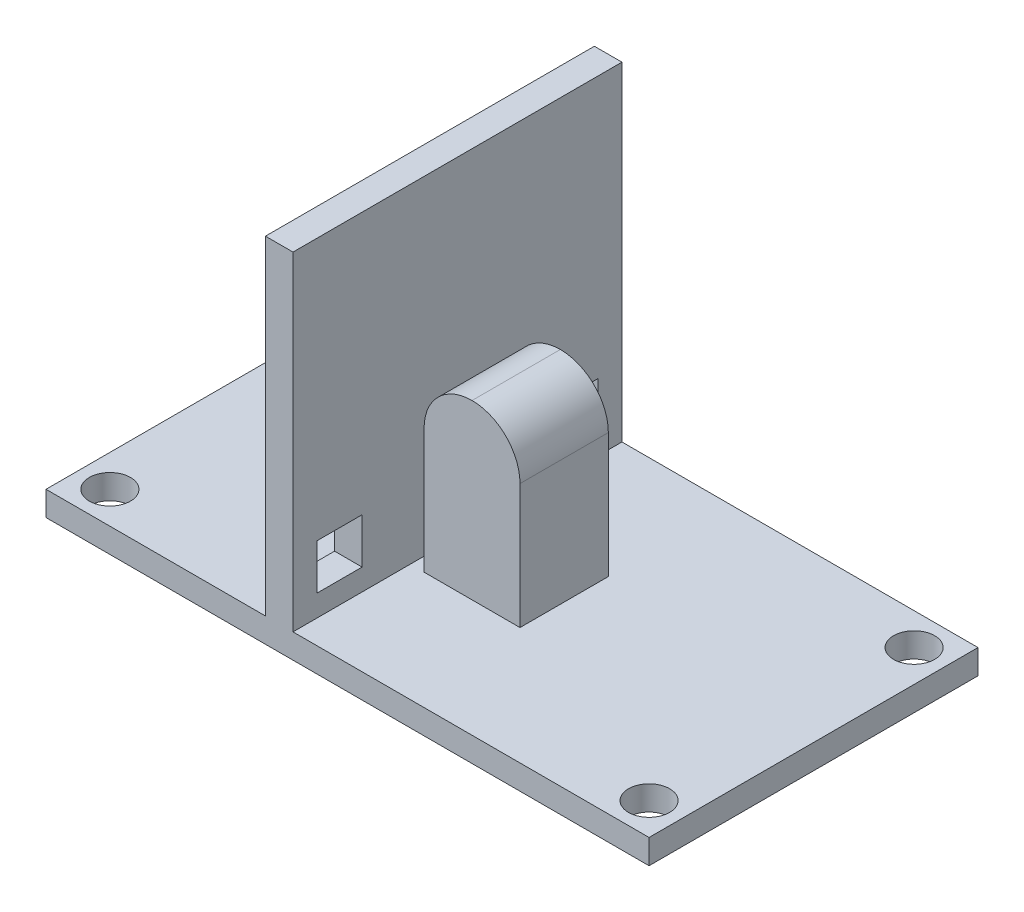
ISO-10303-21;
HEADER;
FILE_DESCRIPTION(('STEP AP214'),'2;1');
FILE_NAME('part.step','',(''),(''),'','','');
FILE_SCHEMA(('AUTOMOTIVE_DESIGN { 1 0 10303 214 1 1 1 1 }'));
ENDSEC;
DATA;
#1=APPLICATION_CONTEXT('core data for automotive mechanical design processes');
#2=APPLICATION_PROTOCOL_DEFINITION('international standard','automotive_design',2000,#1);
#3=PRODUCT_CONTEXT('',#1,'mechanical');
#4=PRODUCT('Part','Part','',(#3));
#5=PRODUCT_RELATED_PRODUCT_CATEGORY('part','',(#4));
#6=PRODUCT_DEFINITION_FORMATION('','',#4);
#7=PRODUCT_DEFINITION_CONTEXT('part definition',#1,'design');
#8=PRODUCT_DEFINITION('design','',#6,#7);
#9=PRODUCT_DEFINITION_SHAPE('','',#8);
#10=(LENGTH_UNIT() NAMED_UNIT(*) SI_UNIT(.MILLI.,.METRE.));
#11=(NAMED_UNIT(*) PLANE_ANGLE_UNIT() SI_UNIT($,.RADIAN.));
#12=(NAMED_UNIT(*) SI_UNIT($,.STERADIAN.) SOLID_ANGLE_UNIT());
#13=UNCERTAINTY_MEASURE_WITH_UNIT(LENGTH_MEASURE(1.E-05),#10,'distance_accuracy_value','');
#14=(GEOMETRIC_REPRESENTATION_CONTEXT(3) GLOBAL_UNCERTAINTY_ASSIGNED_CONTEXT((#13)) GLOBAL_UNIT_ASSIGNED_CONTEXT((#10,
#11,#12)) REPRESENTATION_CONTEXT('',''));
#15=CARTESIAN_POINT('',(0.,0.,0.));
#16=DIRECTION('',(0.,0.,1.));
#17=DIRECTION('',(1.,0.,0.));
#18=AXIS2_PLACEMENT_3D('',#15,#16,#17);
#19=CARTESIAN_POINT('',(0.,2.84,0.));
#20=DIRECTION('',(0.,1.,0.));
#21=DIRECTION('',(0.,0.,1.));
#22=AXIS2_PLACEMENT_3D('',#19,#20,#21);
#23=PLANE('',#22);
#24=CARTESIAN_POINT('',(-54.0349872808047,2.84,-4.2136213119799));
#25=DIRECTION('',(0.,1.,0.));
#26=DIRECTION('',(0.,0.,1.));
#27=AXIS2_PLACEMENT_3D('',#24,#25,#26);
#28=CIRCLE('',#27,2.38125);
#29=CARTESIAN_POINT('',(-54.0349872808047,2.84,-1.8323713119799));
#30=VERTEX_POINT('',#29);
#31=EDGE_CURVE('E340',#30,#30,#28,.T.);
#32=ORIENTED_EDGE('',*,*,#31,.F.);
#33=EDGE_LOOP('',(#32));
#34=FACE_BOUND('',#33,.T.);
#35=CARTESIAN_POINT('',(-54.0349872808047,2.84,26.4863786880201));
#36=DIRECTION('',(0.,1.,0.));
#37=DIRECTION('',(0.,0.,1.));
#38=AXIS2_PLACEMENT_3D('',#35,#36,#37);
#39=CIRCLE('',#38,2.38125);
#40=CARTESIAN_POINT('',(-54.0349872808047,2.84,28.8676286880201));
#41=VERTEX_POINT('',#40);
#42=EDGE_CURVE('E332',#41,#41,#39,.T.);
#43=ORIENTED_EDGE('',*,*,#42,.F.);
#44=EDGE_LOOP('',(#43));
#45=FACE_BOUND('',#44,.T.);
#46=DIRECTION('',(0.,0.,1.));
#47=VECTOR('',#46,1.);
#48=CARTESIAN_POINT('',(-32.3171715619431,2.84,-7.9136213119799));
#49=LINE('',#48,#47);
#50=CARTESIAN_POINT('',(-32.3171715619431,2.84,17.6363786880201));
#51=VERTEX_POINT('',#50);
#52=CARTESIAN_POINT('',(-32.3171715619431,2.84,30.1863786880201));
#53=VERTEX_POINT('',#52);
#54=EDGE_CURVE('E231',#51,#53,#49,.T.);
#55=ORIENTED_EDGE('',*,*,#54,.F.);
#56=DIRECTION('',(1.,0.,0.));
#57=VECTOR('',#56,1.);
#58=CARTESIAN_POINT('',(-36.8171715619431,2.84,17.6363786880201));
#59=LINE('',#58,#57);
#60=CARTESIAN_POINT('',(-44.8171715619431,2.84,17.6363786880201));
#61=VERTEX_POINT('',#60);
#62=EDGE_CURVE('E409',#61,#51,#59,.T.);
#63=ORIENTED_EDGE('',*,*,#62,.F.);
#64=DIRECTION('',(0.,0.,1.));
#65=VECTOR('',#64,1.);
#66=CARTESIAN_POINT('',(-44.8171715619431,2.84,3.1363786880201));
#67=LINE('',#66,#65);
#68=CARTESIAN_POINT('',(-44.8171715619431,2.84,3.1363786880201));
#69=VERTEX_POINT('',#68);
#70=EDGE_CURVE('E212',#69,#61,#67,.T.);
#71=ORIENTED_EDGE('',*,*,#70,.F.);
#72=DIRECTION('',(-1.,0.,0.));
#73=VECTOR('',#72,1.);
#74=CARTESIAN_POINT('',(-36.8171715619431,2.84,3.1363786880201));
#75=LINE('',#74,#73);
#76=CARTESIAN_POINT('',(-32.3171715619431,2.84,3.1363786880201));
#77=VERTEX_POINT('',#76);
#78=EDGE_CURVE('E204',#77,#69,#75,.T.);
#79=ORIENTED_EDGE('',*,*,#78,.F.);
#80=CARTESIAN_POINT('',(-32.3171715619431,2.84,-7.9136213119799));
#81=VERTEX_POINT('',#80);
#82=EDGE_CURVE('E208',#81,#77,#49,.T.);
#83=ORIENTED_EDGE('',*,*,#82,.F.);
#84=DIRECTION('',(-1.,0.,0.));
#85=VECTOR('',#84,1.);
#86=CARTESIAN_POINT('',(-57.7349872808047,2.84,-7.9136213119799));
#87=LINE('',#86,#85);
#88=CARTESIAN_POINT('',(-57.7349872808047,2.84,-7.9136213119799));
#89=VERTEX_POINT('',#88);
#90=EDGE_CURVE('E281',#81,#89,#87,.T.);
#91=ORIENTED_EDGE('',*,*,#90,.T.);
#92=DIRECTION('',(0.,0.,1.));
#93=VECTOR('',#92,1.);
#94=CARTESIAN_POINT('',(-57.7349872808047,2.84,-7.9136213119799));
#95=LINE('',#94,#93);
#96=CARTESIAN_POINT('',(-57.7349872808047,2.84,30.1863786880201));
#97=VERTEX_POINT('',#96);
#98=EDGE_CURVE('E271',#89,#97,#95,.T.);
#99=ORIENTED_EDGE('',*,*,#98,.T.);
#100=DIRECTION('',(1.,0.,0.));
#101=VECTOR('',#100,1.);
#102=CARTESIAN_POINT('',(-57.7349872808047,2.84,30.1863786880201));
#103=LINE('',#102,#101);
#104=EDGE_CURVE('E276',#97,#53,#103,.T.);
#105=ORIENTED_EDGE('',*,*,#104,.T.);
#106=EDGE_LOOP('',(#55,#63,#71,#79,#83,#91,#99,#105));
#107=FACE_BOUND('',#106,.T.);
#108=ADVANCED_FACE('F34',(#34,#45,#107),#23,.T.);
#109=CARTESIAN_POINT('',(-57.7349872808047,2.84,-7.9136213119799));
#110=DIRECTION('',(1.,0.,0.));
#111=DIRECTION('',(0.,0.,-1.));
#112=AXIS2_PLACEMENT_3D('',#109,#110,#111);
#113=PLANE('',#112);
#114=DIRECTION('',(0.,0.,1.));
#115=VECTOR('',#114,1.);
#116=CARTESIAN_POINT('',(-57.7349872808047,0.,-7.9136213119799));
#117=LINE('',#116,#115);
#118=CARTESIAN_POINT('',(-57.7349872808047,0.,-7.9136213119799));
#119=VERTEX_POINT('',#118);
#120=CARTESIAN_POINT('',(-57.7349872808047,0.,30.1863786880201));
#121=VERTEX_POINT('',#120);
#122=EDGE_CURVE('E270',#119,#121,#117,.T.);
#123=ORIENTED_EDGE('',*,*,#122,.T.);
#124=DIRECTION('',(0.,-1.,0.));
#125=VECTOR('',#124,1.);
#126=CARTESIAN_POINT('',(-57.7349872808047,2.84,30.1863786880201));
#127=LINE('',#126,#125);
#128=EDGE_CURVE('E300',#97,#121,#127,.T.);
#129=ORIENTED_EDGE('',*,*,#128,.F.);
#130=ORIENTED_EDGE('',*,*,#98,.F.);
#131=DIRECTION('',(0.,-1.,0.));
#132=VECTOR('',#131,1.);
#133=CARTESIAN_POINT('',(-57.7349872808047,2.84,-7.9136213119799));
#134=LINE('',#133,#132);
#135=EDGE_CURVE('E284',#89,#119,#134,.T.);
#136=ORIENTED_EDGE('',*,*,#135,.T.);
#137=EDGE_LOOP('',(#123,#129,#130,#136));
#138=FACE_BOUND('',#137,.T.);
#139=ADVANCED_FACE('F435',(#138),#113,.F.);
#140=CARTESIAN_POINT('',(-57.7349872808047,2.84,30.1863786880201));
#141=DIRECTION('',(0.,0.,-1.));
#142=DIRECTION('',(-1.,0.,0.));
#143=AXIS2_PLACEMENT_3D('',#140,#141,#142);
#144=PLANE('',#143);
#145=DIRECTION('',(1.,0.,0.));
#146=VECTOR('',#145,1.);
#147=CARTESIAN_POINT('',(-57.7349872808047,0.,30.1863786880201));
#148=LINE('',#147,#146);
#149=CARTESIAN_POINT('',(12.1150127191953,0.,30.1863786880201));
#150=VERTEX_POINT('',#149);
#151=EDGE_CURVE('E287',#121,#150,#148,.T.);
#152=ORIENTED_EDGE('',*,*,#151,.T.);
#153=DIRECTION('',(0.,-1.,0.));
#154=VECTOR('',#153,1.);
#155=CARTESIAN_POINT('',(12.1150127191953,2.84,30.1863786880201));
#156=LINE('',#155,#154);
#157=CARTESIAN_POINT('',(12.1150127191953,2.84,30.1863786880201));
#158=VERTEX_POINT('',#157);
#159=EDGE_CURVE('E297',#158,#150,#156,.T.);
#160=ORIENTED_EDGE('',*,*,#159,.F.);
#161=CARTESIAN_POINT('',(-29.1249872808047,2.84,30.1863786880201));
#162=VERTEX_POINT('',#161);
#163=EDGE_CURVE('E274',#162,#158,#103,.T.);
#164=ORIENTED_EDGE('',*,*,#163,.F.);
#165=DIRECTION('',(0.,-1.,0.));
#166=VECTOR('',#165,1.);
#167=CARTESIAN_POINT('',(-29.1249872808047,40.94,30.1863786880201));
#168=LINE('',#167,#166);
#169=CARTESIAN_POINT('',(-29.1249872808047,40.94,30.1863786880201));
#170=VERTEX_POINT('',#169);
#171=EDGE_CURVE('E243',#170,#162,#168,.T.);
#172=ORIENTED_EDGE('',*,*,#171,.F.);
#173=DIRECTION('',(-1.,0.,0.));
#174=VECTOR('',#173,1.);
#175=CARTESIAN_POINT('',(-29.1249872808047,40.94,30.1863786880201));
#176=LINE('',#175,#174);
#177=CARTESIAN_POINT('',(-32.3171715619431,40.94,30.1863786880201));
#178=VERTEX_POINT('',#177);
#179=EDGE_CURVE('E417',#170,#178,#176,.T.);
#180=ORIENTED_EDGE('',*,*,#179,.T.);
#181=DIRECTION('',(0.,-1.,0.));
#182=VECTOR('',#181,1.);
#183=CARTESIAN_POINT('',(-32.3171715619431,40.94,30.1863786880201));
#184=LINE('',#183,#182);
#185=EDGE_CURVE('E246',#178,#53,#184,.T.);
#186=ORIENTED_EDGE('',*,*,#185,.T.);
#187=ORIENTED_EDGE('',*,*,#104,.F.);
#188=ORIENTED_EDGE('',*,*,#128,.T.);
#189=EDGE_LOOP('',(#152,#160,#164,#172,#180,#186,#187,#188));
#190=FACE_BOUND('',#189,.T.);
#191=ADVANCED_FACE('F430',(#190),#144,.F.);
#192=CARTESIAN_POINT('',(12.1150127191953,2.84,-7.9136213119799));
#193=DIRECTION('',(-1.,0.,0.));
#194=DIRECTION('',(0.,0.,1.));
#195=AXIS2_PLACEMENT_3D('',#192,#193,#194);
#196=PLANE('',#195);
#197=DIRECTION('',(0.,0.,-1.));
#198=VECTOR('',#197,1.);
#199=CARTESIAN_POINT('',(12.1150127191953,0.,-7.9136213119799));
#200=LINE('',#199,#198);
#201=CARTESIAN_POINT('',(12.1150127191953,0.,-7.9136213119799));
#202=VERTEX_POINT('',#201);
#203=EDGE_CURVE('E289',#150,#202,#200,.T.);
#204=ORIENTED_EDGE('',*,*,#203,.T.);
#205=DIRECTION('',(0.,-1.,0.));
#206=VECTOR('',#205,1.);
#207=CARTESIAN_POINT('',(12.1150127191953,2.84,-7.9136213119799));
#208=LINE('',#207,#206);
#209=CARTESIAN_POINT('',(12.1150127191953,2.84,-7.9136213119799));
#210=VERTEX_POINT('',#209);
#211=EDGE_CURVE('E294',#210,#202,#208,.T.);
#212=ORIENTED_EDGE('',*,*,#211,.F.);
#213=DIRECTION('',(0.,0.,-1.));
#214=VECTOR('',#213,1.);
#215=CARTESIAN_POINT('',(12.1150127191953,2.84,-7.9136213119799));
#216=LINE('',#215,#214);
#217=EDGE_CURVE('E279',#158,#210,#216,.T.);
#218=ORIENTED_EDGE('',*,*,#217,.F.);
#219=ORIENTED_EDGE('',*,*,#159,.T.);
#220=EDGE_LOOP('',(#204,#212,#218,#219));
#221=FACE_BOUND('',#220,.T.);
#222=ADVANCED_FACE('F445',(#221),#196,.F.);
#223=CARTESIAN_POINT('',(-57.7349872808047,2.84,-7.9136213119799));
#224=DIRECTION('',(0.,0.,1.));
#225=DIRECTION('',(1.,0.,0.));
#226=AXIS2_PLACEMENT_3D('',#223,#224,#225);
#227=PLANE('',#226);
#228=DIRECTION('',(-1.,0.,0.));
#229=VECTOR('',#228,1.);
#230=CARTESIAN_POINT('',(-57.7349872808047,0.,-7.9136213119799));
#231=LINE('',#230,#229);
#232=EDGE_CURVE('E275',#202,#119,#231,.T.);
#233=ORIENTED_EDGE('',*,*,#232,.T.);
#234=ORIENTED_EDGE('',*,*,#135,.F.);
#235=ORIENTED_EDGE('',*,*,#90,.F.);
#236=DIRECTION('',(0.,-1.,0.));
#237=VECTOR('',#236,1.);
#238=CARTESIAN_POINT('',(-32.3171715619431,40.94,-7.9136213119799));
#239=LINE('',#238,#237);
#240=CARTESIAN_POINT('',(-32.3171715619431,40.94,-7.9136213119799));
#241=VERTEX_POINT('',#240);
#242=EDGE_CURVE('E229',#241,#81,#239,.T.);
#243=ORIENTED_EDGE('',*,*,#242,.F.);
#244=DIRECTION('',(-1.,0.,0.));
#245=VECTOR('',#244,1.);
#246=CARTESIAN_POINT('',(-29.1249872808047,40.94,-7.9136213119799));
#247=LINE('',#246,#245);
#248=CARTESIAN_POINT('',(-29.1249872808047,40.94,-7.9136213119799));
#249=VERTEX_POINT('',#248);
#250=EDGE_CURVE('E233',#249,#241,#247,.T.);
#251=ORIENTED_EDGE('',*,*,#250,.F.);
#252=DIRECTION('',(0.,-1.,0.));
#253=VECTOR('',#252,1.);
#254=CARTESIAN_POINT('',(-29.1249872808047,40.94,-7.9136213119799));
#255=LINE('',#254,#253);
#256=CARTESIAN_POINT('',(-29.1249872808047,2.84,-7.9136213119799));
#257=VERTEX_POINT('',#256);
#258=EDGE_CURVE('E240',#249,#257,#255,.T.);
#259=ORIENTED_EDGE('',*,*,#258,.T.);
#260=EDGE_CURVE('E282',#210,#257,#87,.T.);
#261=ORIENTED_EDGE('',*,*,#260,.F.);
#262=ORIENTED_EDGE('',*,*,#211,.T.);
#263=EDGE_LOOP('',(#233,#234,#235,#243,#251,#259,#261,#262));
#264=FACE_BOUND('',#263,.T.);
#265=ADVANCED_FACE('F452',(#264),#227,.F.);
#266=CARTESIAN_POINT('',(8.41501271919527,2.84,26.4863786880201));
#267=DIRECTION('',(0.,1.,0.));
#268=DIRECTION('',(0.,0.,1.));
#269=AXIS2_PLACEMENT_3D('',#266,#267,#268);
#270=CIRCLE('',#269,2.38125);
#271=CARTESIAN_POINT('',(8.41501271919527,2.84,28.8676286880201));
#272=VERTEX_POINT('',#271);
#273=EDGE_CURVE('E330',#272,#272,#270,.T.);
#274=ORIENTED_EDGE('',*,*,#273,.F.);
#275=EDGE_LOOP('',(#274));
#276=FACE_BOUND('',#275,.T.);
#277=CARTESIAN_POINT('',(8.41501271919527,2.84,-4.2136213119799));
#278=DIRECTION('',(0.,1.,0.));
#279=DIRECTION('',(0.,0.,1.));
#280=AXIS2_PLACEMENT_3D('',#277,#278,#279);
#281=CIRCLE('',#280,2.38125);
#282=CARTESIAN_POINT('',(8.41501271919527,2.84,-1.8323713119799));
#283=VERTEX_POINT('',#282);
#284=EDGE_CURVE('E327',#283,#283,#281,.T.);
#285=ORIENTED_EDGE('',*,*,#284,.F.);
#286=EDGE_LOOP('',(#285));
#287=FACE_BOUND('',#286,.T.);
#288=DIRECTION('',(0.,0.,1.));
#289=VECTOR('',#288,1.);
#290=CARTESIAN_POINT('',(-29.1249872808047,2.84,-7.9136213119799));
#291=LINE('',#290,#289);
#292=EDGE_CURVE('E230',#257,#162,#291,.T.);
#293=ORIENTED_EDGE('',*,*,#292,.T.);
#294=ORIENTED_EDGE('',*,*,#163,.T.);
#295=ORIENTED_EDGE('',*,*,#217,.T.);
#296=ORIENTED_EDGE('',*,*,#260,.T.);
#297=EDGE_LOOP('',(#293,#294,#295,#296));
#298=FACE_BOUND('',#297,.T.);
#299=DIRECTION('',(0.,0.,1.));
#300=VECTOR('',#299,1.);
#301=CARTESIAN_POINT('',(-27.5249872808047,2.84,6.3763786880201));
#302=LINE('',#301,#300);
#303=CARTESIAN_POINT('',(-27.5249872808047,2.84,6.3763786880201));
#304=VERTEX_POINT('',#303);
#305=CARTESIAN_POINT('',(-27.5249872808047,2.84,16.6063786880201));
#306=VERTEX_POINT('',#305);
#307=EDGE_CURVE('E250',#304,#306,#302,.T.);
#308=ORIENTED_EDGE('',*,*,#307,.F.);
#309=DIRECTION('',(-1.,0.,0.));
#310=VECTOR('',#309,1.);
#311=CARTESIAN_POINT('',(-27.5249872808047,2.84,6.3763786880201));
#312=LINE('',#311,#310);
#313=CARTESIAN_POINT('',(-16.4124872808047,2.84,6.3763786880201));
#314=VERTEX_POINT('',#313);
#315=EDGE_CURVE('E259',#314,#304,#312,.T.);
#316=ORIENTED_EDGE('',*,*,#315,.F.);
#317=DIRECTION('',(0.,0.,-1.));
#318=VECTOR('',#317,1.);
#319=CARTESIAN_POINT('',(-16.4124872808047,2.84,6.3763786880201));
#320=LINE('',#319,#318);
#321=CARTESIAN_POINT('',(-16.4124872808047,2.84,16.6063786880201));
#322=VERTEX_POINT('',#321);
#323=EDGE_CURVE('E256',#322,#314,#320,.T.);
#324=ORIENTED_EDGE('',*,*,#323,.F.);
#325=DIRECTION('',(1.,0.,0.));
#326=VECTOR('',#325,1.);
#327=CARTESIAN_POINT('',(-27.5249872808047,2.84,16.6063786880201));
#328=LINE('',#327,#326);
#329=EDGE_CURVE('E253',#306,#322,#328,.T.);
#330=ORIENTED_EDGE('',*,*,#329,.F.);
#331=EDGE_LOOP('',(#308,#316,#324,#330));
#332=FACE_BOUND('',#331,.T.);
#333=ADVANCED_FACE('F449',(#276,#287,#298,#332),#23,.T.);
#334=CARTESIAN_POINT('',(0.,0.,0.));
#335=DIRECTION('',(0.,1.,0.));
#336=DIRECTION('',(0.,0.,1.));
#337=AXIS2_PLACEMENT_3D('',#334,#335,#336);
#338=PLANE('',#337);
#339=CARTESIAN_POINT('',(-54.0349872808047,0.,-4.2136213119799));
#340=DIRECTION('',(0.,1.,0.));
#341=DIRECTION('',(0.,0.,1.));
#342=AXIS2_PLACEMENT_3D('',#339,#340,#341);
#343=CIRCLE('',#342,2.38125);
#344=CARTESIAN_POINT('',(-54.0349872808047,0.,-1.8323713119799));
#345=VERTEX_POINT('',#344);
#346=EDGE_CURVE('E38',#345,#345,#343,.T.);
#347=ORIENTED_EDGE('',*,*,#346,.T.);
#348=EDGE_LOOP('',(#347));
#349=FACE_BOUND('',#348,.T.);
#350=CARTESIAN_POINT('',(-54.0349872808047,0.,26.4863786880201));
#351=DIRECTION('',(0.,1.,0.));
#352=DIRECTION('',(0.,0.,1.));
#353=AXIS2_PLACEMENT_3D('',#350,#351,#352);
#354=CIRCLE('',#353,2.38125);
#355=CARTESIAN_POINT('',(-54.0349872808047,0.,28.8676286880201));
#356=VERTEX_POINT('',#355);
#357=EDGE_CURVE('E224',#356,#356,#354,.T.);
#358=ORIENTED_EDGE('',*,*,#357,.T.);
#359=EDGE_LOOP('',(#358));
#360=FACE_BOUND('',#359,.T.);
#361=CARTESIAN_POINT('',(8.41501271919527,0.,26.4863786880201));
#362=DIRECTION('',(0.,1.,0.));
#363=DIRECTION('',(0.,0.,1.));
#364=AXIS2_PLACEMENT_3D('',#361,#362,#363);
#365=CIRCLE('',#364,2.38125);
#366=CARTESIAN_POINT('',(8.41501271919527,0.,28.8676286880201));
#367=VERTEX_POINT('',#366);
#368=EDGE_CURVE('E328',#367,#367,#365,.T.);
#369=ORIENTED_EDGE('',*,*,#368,.T.);
#370=EDGE_LOOP('',(#369));
#371=FACE_BOUND('',#370,.T.);
#372=CARTESIAN_POINT('',(8.41501271919527,0.,-4.2136213119799));
#373=DIRECTION('',(0.,1.,0.));
#374=DIRECTION('',(0.,0.,1.));
#375=AXIS2_PLACEMENT_3D('',#372,#373,#374);
#376=CIRCLE('',#375,2.38125);
#377=CARTESIAN_POINT('',(8.41501271919527,0.,-1.8323713119799));
#378=VERTEX_POINT('',#377);
#379=EDGE_CURVE('E324',#378,#378,#376,.T.);
#380=ORIENTED_EDGE('',*,*,#379,.T.);
#381=EDGE_LOOP('',(#380));
#382=FACE_BOUND('',#381,.T.);
#383=DIRECTION('',(1.,0.,0.));
#384=VECTOR('',#383,1.);
#385=CARTESIAN_POINT('',(0.,0.,17.6363786880201));
#386=LINE('',#385,#384);
#387=CARTESIAN_POINT('',(-44.8171715619431,0.,17.6363786880201));
#388=VERTEX_POINT('',#387);
#389=CARTESIAN_POINT('',(-32.3171715619431,0.,17.6363786880201));
#390=VERTEX_POINT('',#389);
#391=EDGE_CURVE('E43',#388,#390,#386,.T.);
#392=ORIENTED_EDGE('',*,*,#391,.T.);
#393=DIRECTION('',(0.,0.,-1.));
#394=VECTOR('',#393,1.);
#395=CARTESIAN_POINT('',(-32.3171715619431,0.,0.));
#396=LINE('',#395,#394);
#397=CARTESIAN_POINT('',(-32.3171715619431,0.,3.1363786880201));
#398=VERTEX_POINT('',#397);
#399=EDGE_CURVE('E11',#390,#398,#396,.T.);
#400=ORIENTED_EDGE('',*,*,#399,.T.);
#401=DIRECTION('',(-1.,0.,0.));
#402=VECTOR('',#401,1.);
#403=CARTESIAN_POINT('',(0.,0.,3.13637868802009));
#404=LINE('',#403,#402);
#405=CARTESIAN_POINT('',(-44.8171715619431,0.,3.1363786880201));
#406=VERTEX_POINT('',#405);
#407=EDGE_CURVE('E220',#398,#406,#404,.T.);
#408=ORIENTED_EDGE('',*,*,#407,.T.);
#409=DIRECTION('',(0.,0.,1.));
#410=VECTOR('',#409,1.);
#411=CARTESIAN_POINT('',(-44.8171715619431,0.,0.));
#412=LINE('',#411,#410);
#413=EDGE_CURVE('E320',#406,#388,#412,.T.);
#414=ORIENTED_EDGE('',*,*,#413,.T.);
#415=EDGE_LOOP('',(#392,#400,#408,#414));
#416=FACE_BOUND('',#415,.T.);
#417=ORIENTED_EDGE('',*,*,#122,.F.);
#418=ORIENTED_EDGE('',*,*,#232,.F.);
#419=ORIENTED_EDGE('',*,*,#203,.F.);
#420=ORIENTED_EDGE('',*,*,#151,.F.);
#421=EDGE_LOOP('',(#417,#418,#419,#420));
#422=FACE_BOUND('',#421,.T.);
#423=ADVANCED_FACE('F439',(#349,#360,#371,#382,#416,#422),#338,.F.);
#424=CARTESIAN_POINT('',(-27.5249872808047,22.84,6.3763786880201));
#425=DIRECTION('',(1.,0.,0.));
#426=DIRECTION('',(0.,0.,-1.));
#427=AXIS2_PLACEMENT_3D('',#424,#425,#426);
#428=PLANE('',#427);
#429=DIRECTION('',(0.,-1.,0.));
#430=VECTOR('',#429,1.);
#431=CARTESIAN_POINT('',(-27.5249872808047,22.84,16.6063786880201));
#432=LINE('',#431,#430);
#433=CARTESIAN_POINT('',(-27.5249872808047,17.28375,16.6063786880201));
#434=VERTEX_POINT('',#433);
#435=EDGE_CURVE('E268',#434,#306,#432,.T.);
#436=ORIENTED_EDGE('',*,*,#435,.F.);
#437=DIRECTION('',(0.,0.,1.));
#438=VECTOR('',#437,1.);
#439=CARTESIAN_POINT('',(-27.5249872808047,17.28375,6.3763786880201));
#440=LINE('',#439,#438);
#441=CARTESIAN_POINT('',(-27.5249872808047,17.28375,6.3763786880201));
#442=VERTEX_POINT('',#441);
#443=EDGE_CURVE('E315',#434,#442,#440,.F.);
#444=ORIENTED_EDGE('',*,*,#443,.T.);
#445=DIRECTION('',(0.,-1.,0.));
#446=VECTOR('',#445,1.);
#447=CARTESIAN_POINT('',(-27.5249872808047,22.84,6.3763786880201));
#448=LINE('',#447,#446);
#449=EDGE_CURVE('E262',#442,#304,#448,.T.);
#450=ORIENTED_EDGE('',*,*,#449,.T.);
#451=ORIENTED_EDGE('',*,*,#307,.T.);
#452=EDGE_LOOP('',(#436,#444,#450,#451));
#453=FACE_BOUND('',#452,.T.);
#454=ADVANCED_FACE('F472',(#453),#428,.F.);
#455=CARTESIAN_POINT('',(-27.5249872808047,22.84,16.6063786880201));
#456=DIRECTION('',(0.,0.,-1.));
#457=DIRECTION('',(-1.,0.,0.));
#458=AXIS2_PLACEMENT_3D('',#455,#456,#457);
#459=PLANE('',#458);
#460=CARTESIAN_POINT('',(-21.9687372808047,17.28375,16.6063786880201));
#461=DIRECTION('',(0.,0.,-1.));
#462=DIRECTION('',(-1.,0.,0.));
#463=AXIS2_PLACEMENT_3D('',#460,#461,#462);
#464=CIRCLE('',#463,5.55625);
#465=CARTESIAN_POINT('',(-16.4124872808047,17.28375,16.6063786880201));
#466=VERTEX_POINT('',#465);
#467=CARTESIAN_POINT('',(-21.9687372808047,22.84,16.6063786880201));
#468=VERTEX_POINT('',#467);
#469=EDGE_CURVE('E310',#466,#468,#464,.F.);
#470=ORIENTED_EDGE('',*,*,#469,.T.);
#471=CARTESIAN_POINT('',(-21.9687372808047,17.28375,16.6063786880201));
#472=DIRECTION('',(0.,0.,-1.));
#473=DIRECTION('',(-1.,0.,0.));
#474=AXIS2_PLACEMENT_3D('',#471,#472,#473);
#475=CIRCLE('',#474,5.55625);
#476=EDGE_CURVE('E313',#468,#434,#475,.F.);
#477=ORIENTED_EDGE('',*,*,#476,.T.);
#478=ORIENTED_EDGE('',*,*,#435,.T.);
#479=ORIENTED_EDGE('',*,*,#329,.T.);
#480=DIRECTION('',(0.,-1.,0.));
#481=VECTOR('',#480,1.);
#482=CARTESIAN_POINT('',(-16.4124872808047,22.84,16.6063786880201));
#483=LINE('',#482,#481);
#484=EDGE_CURVE('E266',#466,#322,#483,.T.);
#485=ORIENTED_EDGE('',*,*,#484,.F.);
#486=EDGE_LOOP('',(#470,#477,#478,#479,#485));
#487=FACE_BOUND('',#486,.T.);
#488=ADVANCED_FACE('F479',(#487),#459,.F.);
#489=CARTESIAN_POINT('',(-16.4124872808047,22.84,6.3763786880201));
#490=DIRECTION('',(-1.,0.,0.));
#491=DIRECTION('',(0.,0.,1.));
#492=AXIS2_PLACEMENT_3D('',#489,#490,#491);
#493=PLANE('',#492);
#494=DIRECTION('',(0.,-1.,0.));
#495=VECTOR('',#494,1.);
#496=CARTESIAN_POINT('',(-16.4124872808047,22.84,6.3763786880201));
#497=LINE('',#496,#495);
#498=CARTESIAN_POINT('',(-16.4124872808047,17.28375,6.3763786880201));
#499=VERTEX_POINT('',#498);
#500=EDGE_CURVE('E264',#499,#314,#497,.T.);
#501=ORIENTED_EDGE('',*,*,#500,.F.);
#502=DIRECTION('',(0.,0.,-1.));
#503=VECTOR('',#502,1.);
#504=CARTESIAN_POINT('',(-16.4124872808047,17.28375,16.6063786880201));
#505=LINE('',#504,#503);
#506=EDGE_CURVE('E308',#499,#466,#505,.F.);
#507=ORIENTED_EDGE('',*,*,#506,.T.);
#508=ORIENTED_EDGE('',*,*,#484,.T.);
#509=ORIENTED_EDGE('',*,*,#323,.T.);
#510=EDGE_LOOP('',(#501,#507,#508,#509));
#511=FACE_BOUND('',#510,.T.);
#512=ADVANCED_FACE('F517',(#511),#493,.F.);
#513=CARTESIAN_POINT('',(-27.5249872808047,22.84,6.3763786880201));
#514=DIRECTION('',(0.,0.,1.));
#515=DIRECTION('',(1.,0.,0.));
#516=AXIS2_PLACEMENT_3D('',#513,#514,#515);
#517=PLANE('',#516);
#518=ORIENTED_EDGE('',*,*,#449,.F.);
#519=CARTESIAN_POINT('',(-21.9687372808047,17.28375,6.3763786880201));
#520=DIRECTION('',(0.,0.,1.));
#521=DIRECTION('',(1.,0.,0.));
#522=AXIS2_PLACEMENT_3D('',#519,#520,#521);
#523=CIRCLE('',#522,5.55625);
#524=CARTESIAN_POINT('',(-21.9687372808047,22.84,6.3763786880201));
#525=VERTEX_POINT('',#524);
#526=EDGE_CURVE('E317',#442,#525,#523,.F.);
#527=ORIENTED_EDGE('',*,*,#526,.T.);
#528=CARTESIAN_POINT('',(-21.9687372808047,17.28375,6.3763786880201));
#529=DIRECTION('',(0.,0.,1.));
#530=DIRECTION('',(1.,0.,0.));
#531=AXIS2_PLACEMENT_3D('',#528,#529,#530);
#532=CIRCLE('',#531,5.55625);
#533=EDGE_CURVE('E306',#525,#499,#532,.F.);
#534=ORIENTED_EDGE('',*,*,#533,.T.);
#535=ORIENTED_EDGE('',*,*,#500,.T.);
#536=ORIENTED_EDGE('',*,*,#315,.T.);
#537=EDGE_LOOP('',(#518,#527,#534,#535,#536));
#538=FACE_BOUND('',#537,.T.);
#539=ADVANCED_FACE('F513',(#538),#517,.F.);
#540=CARTESIAN_POINT('',(-32.3171715619431,40.94,-7.9136213119799));
#541=DIRECTION('',(1.,0.,0.));
#542=DIRECTION('',(0.,0.,-1.));
#543=AXIS2_PLACEMENT_3D('',#540,#541,#542);
#544=PLANE('',#543);
#545=DIRECTION('',(0.,0.,-1.));
#546=VECTOR('',#545,1.);
#547=CARTESIAN_POINT('',(-32.3171715619431,5.34,-7.91362131197991));
#548=LINE('',#547,#546);
#549=CARTESIAN_POINT('',(-32.3171715619431,5.34,27.4363786880201));
#550=VERTEX_POINT('',#549);
#551=CARTESIAN_POINT('',(-32.3171715619431,5.34,22.1833786880201));
#552=VERTEX_POINT('',#551);
#553=EDGE_CURVE('E371',#550,#552,#548,.T.);
#554=ORIENTED_EDGE('',*,*,#553,.T.);
#555=DIRECTION('',(0.,1.,0.));
#556=VECTOR('',#555,1.);
#557=CARTESIAN_POINT('',(-32.3171715619431,40.94,22.1833786880201));
#558=LINE('',#557,#556);
#559=CARTESIAN_POINT('',(-32.3171715619431,10.59,22.1833786880201));
#560=VERTEX_POINT('',#559);
#561=EDGE_CURVE('E374',#552,#560,#558,.T.);
#562=ORIENTED_EDGE('',*,*,#561,.T.);
#563=DIRECTION('',(0.,0.,1.));
#564=VECTOR('',#563,1.);
#565=CARTESIAN_POINT('',(-32.3171715619431,10.59,-7.91362131197991));
#566=LINE('',#565,#564);
#567=CARTESIAN_POINT('',(-32.3171715619431,10.59,27.4363786880201));
#568=VERTEX_POINT('',#567);
#569=EDGE_CURVE('E361',#560,#568,#566,.T.);
#570=ORIENTED_EDGE('',*,*,#569,.T.);
#571=DIRECTION('',(0.,-1.,0.));
#572=VECTOR('',#571,1.);
#573=CARTESIAN_POINT('',(-32.3171715619431,40.94,27.4363786880201));
#574=LINE('',#573,#572);
#575=EDGE_CURVE('E368',#568,#550,#574,.T.);
#576=ORIENTED_EDGE('',*,*,#575,.T.);
#577=EDGE_LOOP('',(#554,#562,#570,#576));
#578=FACE_BOUND('',#577,.T.);
#579=DIRECTION('',(0.,0.,-1.));
#580=VECTOR('',#579,1.);
#581=CARTESIAN_POINT('',(-32.3171715619431,5.34,-7.91362131197991));
#582=LINE('',#581,#580);
#583=CARTESIAN_POINT('',(-32.3171715619431,5.34,0.0863786880200968));
#584=VERTEX_POINT('',#583);
#585=CARTESIAN_POINT('',(-32.3171715619431,5.34,-5.1636213119799));
#586=VERTEX_POINT('',#585);
#587=EDGE_CURVE('E403',#584,#586,#582,.T.);
#588=ORIENTED_EDGE('',*,*,#587,.T.);
#589=DIRECTION('',(0.,1.,0.));
#590=VECTOR('',#589,1.);
#591=CARTESIAN_POINT('',(-32.3171715619431,40.94,-5.1636213119799));
#592=LINE('',#591,#590);
#593=CARTESIAN_POINT('',(-32.3171715619431,10.59,-5.1636213119799));
#594=VERTEX_POINT('',#593);
#595=EDGE_CURVE('E214',#586,#594,#592,.T.);
#596=ORIENTED_EDGE('',*,*,#595,.T.);
#597=DIRECTION('',(0.,0.,1.));
#598=VECTOR('',#597,1.);
#599=CARTESIAN_POINT('',(-32.3171715619431,10.59,-7.9136213119799));
#600=LINE('',#599,#598);
#601=CARTESIAN_POINT('',(-32.3171715619431,10.59,0.0863786880200973));
#602=VERTEX_POINT('',#601);
#603=EDGE_CURVE('E391',#594,#602,#600,.T.);
#604=ORIENTED_EDGE('',*,*,#603,.T.);
#605=DIRECTION('',(0.,-1.,0.));
#606=VECTOR('',#605,1.);
#607=CARTESIAN_POINT('',(-32.3171715619431,40.94,0.0863786880200973));
#608=LINE('',#607,#606);
#609=EDGE_CURVE('E400',#602,#584,#608,.T.);
#610=ORIENTED_EDGE('',*,*,#609,.T.);
#611=EDGE_LOOP('',(#588,#596,#604,#610));
#612=FACE_BOUND('',#611,.T.);
#613=ORIENTED_EDGE('',*,*,#82,.T.);
#614=DIRECTION('',(0.,1.,0.));
#615=VECTOR('',#614,1.);
#616=CARTESIAN_POINT('',(-32.3171715619431,-7.16,3.1363786880201));
#617=LINE('',#616,#615);
#618=EDGE_CURVE('E217',#398,#77,#617,.T.);
#619=ORIENTED_EDGE('',*,*,#618,.F.);
#620=ORIENTED_EDGE('',*,*,#399,.F.);
#621=DIRECTION('',(0.,1.,0.));
#622=VECTOR('',#621,1.);
#623=CARTESIAN_POINT('',(-32.3171715619431,-7.16,17.6363786880201));
#624=LINE('',#623,#622);
#625=EDGE_CURVE('E223',#390,#51,#624,.T.);
#626=ORIENTED_EDGE('',*,*,#625,.T.);
#627=ORIENTED_EDGE('',*,*,#54,.T.);
#628=ORIENTED_EDGE('',*,*,#185,.F.);
#629=DIRECTION('',(0.,0.,1.));
#630=VECTOR('',#629,1.);
#631=CARTESIAN_POINT('',(-32.3171715619431,40.94,-7.9136213119799));
#632=LINE('',#631,#630);
#633=EDGE_CURVE('E416',#241,#178,#632,.T.);
#634=ORIENTED_EDGE('',*,*,#633,.F.);
#635=ORIENTED_EDGE('',*,*,#242,.T.);
#636=EDGE_LOOP('',(#613,#619,#620,#626,#627,#628,#634,#635));
#637=FACE_BOUND('',#636,.T.);
#638=ADVANCED_FACE('F227',(#578,#612,#637),#544,.F.);
#639=CARTESIAN_POINT('',(-29.1249872808047,40.94,-7.9136213119799));
#640=DIRECTION('',(1.,0.,0.));
#641=DIRECTION('',(0.,0.,-1.));
#642=AXIS2_PLACEMENT_3D('',#639,#640,#641);
#643=PLANE('',#642);
#644=DIRECTION('',(0.,1.,0.));
#645=VECTOR('',#644,1.);
#646=CARTESIAN_POINT('',(-29.1249872808047,5.34,22.1833786880201));
#647=LINE('',#646,#645);
#648=CARTESIAN_POINT('',(-29.1249872808047,5.34,22.1833786880201));
#649=VERTEX_POINT('',#648);
#650=CARTESIAN_POINT('',(-29.1249872808047,10.59,22.1833786880201));
#651=VERTEX_POINT('',#650);
#652=EDGE_CURVE('E59',#649,#651,#647,.T.);
#653=ORIENTED_EDGE('',*,*,#652,.F.);
#654=DIRECTION('',(0.,0.,-1.));
#655=VECTOR('',#654,1.);
#656=CARTESIAN_POINT('',(-29.1249872808047,5.34,22.1833786880201));
#657=LINE('',#656,#655);
#658=CARTESIAN_POINT('',(-29.1249872808047,5.34,27.4363786880201));
#659=VERTEX_POINT('',#658);
#660=EDGE_CURVE('E355',#659,#649,#657,.T.);
#661=ORIENTED_EDGE('',*,*,#660,.F.);
#662=DIRECTION('',(0.,-1.,0.));
#663=VECTOR('',#662,1.);
#664=CARTESIAN_POINT('',(-29.1249872808047,5.34,27.4363786880201));
#665=LINE('',#664,#663);
#666=CARTESIAN_POINT('',(-29.1249872808047,10.59,27.4363786880201));
#667=VERTEX_POINT('',#666);
#668=EDGE_CURVE('E352',#667,#659,#665,.T.);
#669=ORIENTED_EDGE('',*,*,#668,.F.);
#670=DIRECTION('',(0.,0.,1.));
#671=VECTOR('',#670,1.);
#672=CARTESIAN_POINT('',(-29.1249872808047,10.59,22.1833786880201));
#673=LINE('',#672,#671);
#674=EDGE_CURVE('E350',#651,#667,#673,.T.);
#675=ORIENTED_EDGE('',*,*,#674,.F.);
#676=EDGE_LOOP('',(#653,#661,#669,#675));
#677=FACE_BOUND('',#676,.T.);
#678=DIRECTION('',(0.,1.,0.));
#679=VECTOR('',#678,1.);
#680=CARTESIAN_POINT('',(-29.1249872808047,5.34,-5.1636213119799));
#681=LINE('',#680,#679);
#682=CARTESIAN_POINT('',(-29.1249872808047,5.34,-5.1636213119799));
#683=VERTEX_POINT('',#682);
#684=CARTESIAN_POINT('',(-29.1249872808047,10.59,-5.1636213119799));
#685=VERTEX_POINT('',#684);
#686=EDGE_CURVE('E377',#683,#685,#681,.T.);
#687=ORIENTED_EDGE('',*,*,#686,.F.);
#688=DIRECTION('',(0.,0.,-1.));
#689=VECTOR('',#688,1.);
#690=CARTESIAN_POINT('',(-29.1249872808047,5.34,-5.1636213119799));
#691=LINE('',#690,#689);
#692=CARTESIAN_POINT('',(-29.1249872808047,5.34,0.0863786880200965));
#693=VERTEX_POINT('',#692);
#694=EDGE_CURVE('E385',#693,#683,#691,.T.);
#695=ORIENTED_EDGE('',*,*,#694,.F.);
#696=DIRECTION('',(0.,-1.,0.));
#697=VECTOR('',#696,1.);
#698=CARTESIAN_POINT('',(-29.1249872808047,5.34,0.0863786880200965));
#699=LINE('',#698,#697);
#700=CARTESIAN_POINT('',(-29.1249872808047,10.59,0.0863786880200965));
#701=VERTEX_POINT('',#700);
#702=EDGE_CURVE('E382',#701,#693,#699,.T.);
#703=ORIENTED_EDGE('',*,*,#702,.F.);
#704=DIRECTION('',(0.,0.,1.));
#705=VECTOR('',#704,1.);
#706=CARTESIAN_POINT('',(-29.1249872808047,10.59,-5.1636213119799));
#707=LINE('',#706,#705);
#708=EDGE_CURVE('E379',#685,#701,#707,.T.);
#709=ORIENTED_EDGE('',*,*,#708,.F.);
#710=EDGE_LOOP('',(#687,#695,#703,#709));
#711=FACE_BOUND('',#710,.T.);
#712=ORIENTED_EDGE('',*,*,#292,.F.);
#713=ORIENTED_EDGE('',*,*,#258,.F.);
#714=DIRECTION('',(0.,0.,1.));
#715=VECTOR('',#714,1.);
#716=CARTESIAN_POINT('',(-29.1249872808047,40.94,-7.9136213119799));
#717=LINE('',#716,#715);
#718=EDGE_CURVE('E237',#249,#170,#717,.T.);
#719=ORIENTED_EDGE('',*,*,#718,.T.);
#720=ORIENTED_EDGE('',*,*,#171,.T.);
#721=EDGE_LOOP('',(#712,#713,#719,#720));
#722=FACE_BOUND('',#721,.T.);
#723=ADVANCED_FACE('F425',(#677,#711,#722),#643,.T.);
#724=CARTESIAN_POINT('',(0.,40.94,0.));
#725=DIRECTION('',(0.,1.,0.));
#726=DIRECTION('',(0.,0.,1.));
#727=AXIS2_PLACEMENT_3D('',#724,#725,#726);
#728=PLANE('',#727);
#729=ORIENTED_EDGE('',*,*,#250,.T.);
#730=ORIENTED_EDGE('',*,*,#633,.T.);
#731=ORIENTED_EDGE('',*,*,#179,.F.);
#732=ORIENTED_EDGE('',*,*,#718,.F.);
#733=EDGE_LOOP('',(#729,#730,#731,#732));
#734=FACE_BOUND('',#733,.T.);
#735=ADVANCED_FACE('F428',(#734),#728,.T.);
#736=CARTESIAN_POINT('',(-21.9687372808047,17.28375,0.));
#737=DIRECTION('',(0.,0.,1.));
#738=DIRECTION('',(1.,0.,0.));
#739=AXIS2_PLACEMENT_3D('',#736,#737,#738);
#740=CYLINDRICAL_SURFACE('',#739,5.55625);
#741=ORIENTED_EDGE('',*,*,#469,.F.);
#742=ORIENTED_EDGE('',*,*,#506,.F.);
#743=ORIENTED_EDGE('',*,*,#533,.F.);
#744=DIRECTION('',(0.,0.,-1.));
#745=VECTOR('',#744,1.);
#746=CARTESIAN_POINT('',(-21.9687372808047,22.84,6.3763786880201));
#747=LINE('',#746,#745);
#748=EDGE_CURVE('E303',#468,#525,#747,.T.);
#749=ORIENTED_EDGE('',*,*,#748,.F.);
#750=EDGE_LOOP('',(#741,#742,#743,#749));
#751=FACE_BOUND('',#750,.T.);
#752=ADVANCED_FACE('F507',(#751),#740,.T.);
#753=CARTESIAN_POINT('',(-21.9687372808047,17.28375,0.));
#754=DIRECTION('',(0.,0.,-1.));
#755=DIRECTION('',(-1.,0.,0.));
#756=AXIS2_PLACEMENT_3D('',#753,#754,#755);
#757=CYLINDRICAL_SURFACE('',#756,5.55625);
#758=ORIENTED_EDGE('',*,*,#526,.F.);
#759=ORIENTED_EDGE('',*,*,#443,.F.);
#760=ORIENTED_EDGE('',*,*,#476,.F.);
#761=ORIENTED_EDGE('',*,*,#748,.T.);
#762=EDGE_LOOP('',(#758,#759,#760,#761));
#763=FACE_BOUND('',#762,.T.);
#764=ADVANCED_FACE('F36',(#763),#757,.T.);
#765=CARTESIAN_POINT('',(-36.8171715619431,-35.26,17.6363786880201));
#766=DIRECTION('',(0.,0.,1.));
#767=DIRECTION('',(1.,0.,0.));
#768=AXIS2_PLACEMENT_3D('',#765,#766,#767);
#769=PLANE('',#768);
#770=DIRECTION('',(0.,1.,0.));
#771=VECTOR('',#770,1.);
#772=CARTESIAN_POINT('',(-44.8171715619431,-35.26,17.6363786880201));
#773=LINE('',#772,#771);
#774=EDGE_CURVE('E235',#388,#61,#773,.T.);
#775=ORIENTED_EDGE('',*,*,#774,.T.);
#776=ORIENTED_EDGE('',*,*,#62,.T.);
#777=ORIENTED_EDGE('',*,*,#625,.F.);
#778=ORIENTED_EDGE('',*,*,#391,.F.);
#779=EDGE_LOOP('',(#775,#776,#777,#778));
#780=FACE_BOUND('',#779,.T.);
#781=ADVANCED_FACE('F491',(#780),#769,.F.);
#782=CARTESIAN_POINT('',(-44.8171715619431,-35.26,3.1363786880201));
#783=DIRECTION('',(-1.,0.,0.));
#784=DIRECTION('',(0.,0.,1.));
#785=AXIS2_PLACEMENT_3D('',#782,#783,#784);
#786=PLANE('',#785);
#787=DIRECTION('',(0.,1.,0.));
#788=VECTOR('',#787,1.);
#789=CARTESIAN_POINT('',(-44.8171715619431,-35.26,3.1363786880201));
#790=LINE('',#789,#788);
#791=EDGE_CURVE('E411',#406,#69,#790,.T.);
#792=ORIENTED_EDGE('',*,*,#791,.T.);
#793=ORIENTED_EDGE('',*,*,#70,.T.);
#794=ORIENTED_EDGE('',*,*,#774,.F.);
#795=ORIENTED_EDGE('',*,*,#413,.F.);
#796=EDGE_LOOP('',(#792,#793,#794,#795));
#797=FACE_BOUND('',#796,.T.);
#798=ADVANCED_FACE('F493',(#797),#786,.F.);
#799=CARTESIAN_POINT('',(-36.8171715619431,-35.26,3.1363786880201));
#800=DIRECTION('',(0.,0.,-1.));
#801=DIRECTION('',(-1.,0.,0.));
#802=AXIS2_PLACEMENT_3D('',#799,#800,#801);
#803=PLANE('',#802);
#804=ORIENTED_EDGE('',*,*,#407,.F.);
#805=ORIENTED_EDGE('',*,*,#618,.T.);
#806=ORIENTED_EDGE('',*,*,#78,.T.);
#807=ORIENTED_EDGE('',*,*,#791,.F.);
#808=EDGE_LOOP('',(#804,#805,#806,#807));
#809=FACE_BOUND('',#808,.T.);
#810=ADVANCED_FACE('F218',(#809),#803,.F.);
#811=CARTESIAN_POINT('',(-39.1249872808047,5.34,-5.1636213119799));
#812=DIRECTION('',(0.,0.,-1.));
#813=DIRECTION('',(-1.,0.,0.));
#814=AXIS2_PLACEMENT_3D('',#811,#812,#813);
#815=PLANE('',#814);
#816=DIRECTION('',(1.,0.,0.));
#817=VECTOR('',#816,1.);
#818=CARTESIAN_POINT('',(-39.1249872808047,5.34,-5.1636213119799));
#819=LINE('',#818,#817);
#820=EDGE_CURVE('E389',#586,#683,#819,.T.);
#821=ORIENTED_EDGE('',*,*,#820,.T.);
#822=ORIENTED_EDGE('',*,*,#686,.T.);
#823=DIRECTION('',(1.,0.,0.));
#824=VECTOR('',#823,1.);
#825=CARTESIAN_POINT('',(-39.1249872808047,10.59,-5.1636213119799));
#826=LINE('',#825,#824);
#827=EDGE_CURVE('E388',#594,#685,#826,.T.);
#828=ORIENTED_EDGE('',*,*,#827,.F.);
#829=ORIENTED_EDGE('',*,*,#595,.F.);
#830=EDGE_LOOP('',(#821,#822,#828,#829));
#831=FACE_BOUND('',#830,.T.);
#832=ADVANCED_FACE('F500',(#831),#815,.F.);
#833=CARTESIAN_POINT('',(-39.1249872808047,5.34,-5.1636213119799));
#834=DIRECTION('',(0.,-1.,0.));
#835=DIRECTION('',(0.,0.,-1.));
#836=AXIS2_PLACEMENT_3D('',#833,#834,#835);
#837=PLANE('',#836);
#838=DIRECTION('',(1.,0.,0.));
#839=VECTOR('',#838,1.);
#840=CARTESIAN_POINT('',(-39.1249872808047,5.34,0.0863786880200974));
#841=LINE('',#840,#839);
#842=EDGE_CURVE('E392',#584,#693,#841,.T.);
#843=ORIENTED_EDGE('',*,*,#842,.T.);
#844=ORIENTED_EDGE('',*,*,#694,.T.);
#845=ORIENTED_EDGE('',*,*,#820,.F.);
#846=ORIENTED_EDGE('',*,*,#587,.F.);
#847=EDGE_LOOP('',(#843,#844,#845,#846));
#848=FACE_BOUND('',#847,.T.);
#849=ADVANCED_FACE('F637',(#848),#837,.F.);
#850=CARTESIAN_POINT('',(-39.1249872808047,5.34,0.0863786880200974));
#851=DIRECTION('',(0.,0.,1.));
#852=DIRECTION('',(1.,0.,0.));
#853=AXIS2_PLACEMENT_3D('',#850,#851,#852);
#854=PLANE('',#853);
#855=DIRECTION('',(1.,0.,0.));
#856=VECTOR('',#855,1.);
#857=CARTESIAN_POINT('',(-39.1249872808047,10.59,0.0863786880200974));
#858=LINE('',#857,#856);
#859=EDGE_CURVE('E394',#602,#701,#858,.T.);
#860=ORIENTED_EDGE('',*,*,#859,.T.);
#861=ORIENTED_EDGE('',*,*,#702,.T.);
#862=ORIENTED_EDGE('',*,*,#842,.F.);
#863=ORIENTED_EDGE('',*,*,#609,.F.);
#864=EDGE_LOOP('',(#860,#861,#862,#863));
#865=FACE_BOUND('',#864,.T.);
#866=ADVANCED_FACE('F645',(#865),#854,.F.);
#867=CARTESIAN_POINT('',(-39.1249872808047,10.59,-5.1636213119799));
#868=DIRECTION('',(0.,1.,0.));
#869=DIRECTION('',(0.,0.,1.));
#870=AXIS2_PLACEMENT_3D('',#867,#868,#869);
#871=PLANE('',#870);
#872=ORIENTED_EDGE('',*,*,#827,.T.);
#873=ORIENTED_EDGE('',*,*,#708,.T.);
#874=ORIENTED_EDGE('',*,*,#859,.F.);
#875=ORIENTED_EDGE('',*,*,#603,.F.);
#876=EDGE_LOOP('',(#872,#873,#874,#875));
#877=FACE_BOUND('',#876,.T.);
#878=ADVANCED_FACE('F654',(#877),#871,.F.);
#879=CARTESIAN_POINT('',(-39.1249872808047,5.34,22.1833786880201));
#880=DIRECTION('',(0.,0.,-1.));
#881=DIRECTION('',(-1.,0.,0.));
#882=AXIS2_PLACEMENT_3D('',#879,#880,#881);
#883=PLANE('',#882);
#884=DIRECTION('',(1.,0.,0.));
#885=VECTOR('',#884,1.);
#886=CARTESIAN_POINT('',(-39.1249872808047,5.34,22.1833786880201));
#887=LINE('',#886,#885);
#888=EDGE_CURVE('E359',#552,#649,#887,.T.);
#889=ORIENTED_EDGE('',*,*,#888,.T.);
#890=ORIENTED_EDGE('',*,*,#652,.T.);
#891=DIRECTION('',(1.,0.,0.));
#892=VECTOR('',#891,1.);
#893=CARTESIAN_POINT('',(-39.1249872808047,10.59,22.1833786880201));
#894=LINE('',#893,#892);
#895=EDGE_CURVE('E358',#560,#651,#894,.T.);
#896=ORIENTED_EDGE('',*,*,#895,.F.);
#897=ORIENTED_EDGE('',*,*,#561,.F.);
#898=EDGE_LOOP('',(#889,#890,#896,#897));
#899=FACE_BOUND('',#898,.T.);
#900=ADVANCED_FACE('F662',(#899),#883,.F.);
#901=CARTESIAN_POINT('',(-39.1249872808047,5.34,22.1833786880201));
#902=DIRECTION('',(0.,-1.,0.));
#903=DIRECTION('',(0.,0.,-1.));
#904=AXIS2_PLACEMENT_3D('',#901,#902,#903);
#905=PLANE('',#904);
#906=DIRECTION('',(1.,0.,0.));
#907=VECTOR('',#906,1.);
#908=CARTESIAN_POINT('',(-39.1249872808047,5.34,27.4363786880201));
#909=LINE('',#908,#907);
#910=EDGE_CURVE('E362',#550,#659,#909,.T.);
#911=ORIENTED_EDGE('',*,*,#910,.T.);
#912=ORIENTED_EDGE('',*,*,#660,.T.);
#913=ORIENTED_EDGE('',*,*,#888,.F.);
#914=ORIENTED_EDGE('',*,*,#553,.F.);
#915=EDGE_LOOP('',(#911,#912,#913,#914));
#916=FACE_BOUND('',#915,.T.);
#917=ADVANCED_FACE('F670',(#916),#905,.F.);
#918=CARTESIAN_POINT('',(-39.1249872808047,5.34,27.4363786880201));
#919=DIRECTION('',(0.,0.,1.));
#920=DIRECTION('',(1.,0.,0.));
#921=AXIS2_PLACEMENT_3D('',#918,#919,#920);
#922=PLANE('',#921);
#923=DIRECTION('',(1.,0.,0.));
#924=VECTOR('',#923,1.);
#925=CARTESIAN_POINT('',(-39.1249872808047,10.59,27.4363786880201));
#926=LINE('',#925,#924);
#927=EDGE_CURVE('E51',#568,#667,#926,.T.);
#928=ORIENTED_EDGE('',*,*,#927,.T.);
#929=ORIENTED_EDGE('',*,*,#668,.T.);
#930=ORIENTED_EDGE('',*,*,#910,.F.);
#931=ORIENTED_EDGE('',*,*,#575,.F.);
#932=EDGE_LOOP('',(#928,#929,#930,#931));
#933=FACE_BOUND('',#932,.T.);
#934=ADVANCED_FACE('F678',(#933),#922,.F.);
#935=CARTESIAN_POINT('',(-39.1249872808047,10.59,22.1833786880201));
#936=DIRECTION('',(0.,1.,0.));
#937=DIRECTION('',(0.,0.,1.));
#938=AXIS2_PLACEMENT_3D('',#935,#936,#937);
#939=PLANE('',#938);
#940=ORIENTED_EDGE('',*,*,#895,.T.);
#941=ORIENTED_EDGE('',*,*,#674,.T.);
#942=ORIENTED_EDGE('',*,*,#927,.F.);
#943=ORIENTED_EDGE('',*,*,#569,.F.);
#944=EDGE_LOOP('',(#940,#941,#942,#943));
#945=FACE_BOUND('',#944,.T.);
#946=ADVANCED_FACE('F687',(#945),#939,.F.);
#947=CARTESIAN_POINT('',(8.41501271919527,-7.16,-4.2136213119799));
#948=DIRECTION('',(0.,1.,0.));
#949=DIRECTION('',(0.,0.,1.));
#950=AXIS2_PLACEMENT_3D('',#947,#948,#949);
#951=CYLINDRICAL_SURFACE('',#950,2.38125);
#952=ORIENTED_EDGE('',*,*,#284,.T.);
#953=EDGE_LOOP('',(#952));
#954=FACE_BOUND('',#953,.T.);
#955=ORIENTED_EDGE('',*,*,#379,.F.);
#956=EDGE_LOOP('',(#955));
#957=FACE_BOUND('',#956,.T.);
#958=ADVANCED_FACE('F696',(#954,#957),#951,.F.);
#959=CARTESIAN_POINT('',(8.41501271919527,-7.16,26.4863786880201));
#960=DIRECTION('',(0.,1.,0.));
#961=DIRECTION('',(0.,0.,1.));
#962=AXIS2_PLACEMENT_3D('',#959,#960,#961);
#963=CYLINDRICAL_SURFACE('',#962,2.38125);
#964=ORIENTED_EDGE('',*,*,#273,.T.);
#965=EDGE_LOOP('',(#964));
#966=FACE_BOUND('',#965,.T.);
#967=ORIENTED_EDGE('',*,*,#368,.F.);
#968=EDGE_LOOP('',(#967));
#969=FACE_BOUND('',#968,.T.);
#970=ADVANCED_FACE('F703',(#966,#969),#963,.F.);
#971=CARTESIAN_POINT('',(-54.0349872808047,-7.16,26.4863786880201));
#972=DIRECTION('',(0.,1.,0.));
#973=DIRECTION('',(0.,0.,1.));
#974=AXIS2_PLACEMENT_3D('',#971,#972,#973);
#975=CYLINDRICAL_SURFACE('',#974,2.38125);
#976=ORIENTED_EDGE('',*,*,#42,.T.);
#977=EDGE_LOOP('',(#976));
#978=FACE_BOUND('',#977,.T.);
#979=ORIENTED_EDGE('',*,*,#357,.F.);
#980=EDGE_LOOP('',(#979));
#981=FACE_BOUND('',#980,.T.);
#982=ADVANCED_FACE('F712',(#978,#981),#975,.F.);
#983=CARTESIAN_POINT('',(-54.0349872808047,-7.16,-4.2136213119799));
#984=DIRECTION('',(0.,1.,0.));
#985=DIRECTION('',(0.,0.,1.));
#986=AXIS2_PLACEMENT_3D('',#983,#984,#985);
#987=CYLINDRICAL_SURFACE('',#986,2.38125);
#988=ORIENTED_EDGE('',*,*,#31,.T.);
#989=EDGE_LOOP('',(#988));
#990=FACE_BOUND('',#989,.T.);
#991=ORIENTED_EDGE('',*,*,#346,.F.);
#992=EDGE_LOOP('',(#991));
#993=FACE_BOUND('',#992,.T.);
#994=ADVANCED_FACE('F727',(#990,#993),#987,.F.);
#995=CLOSED_SHELL('',(#108,#139,#191,#222,#265,#333,#423,#454,#488,#512,#539,#638,#723,#735,
#752,#764,#781,#798,#810,#832,#849,#866,#878,#900,#917,#934,#946,#958,#970,#982,#994));
#996=MANIFOLD_SOLID_BREP('B2',#995);
#997=ADVANCED_BREP_SHAPE_REPRESENTATION('',(#18,#996),#14);
#998=SHAPE_DEFINITION_REPRESENTATION(#9,#997);
ENDSEC;
END-ISO-10303-21;
